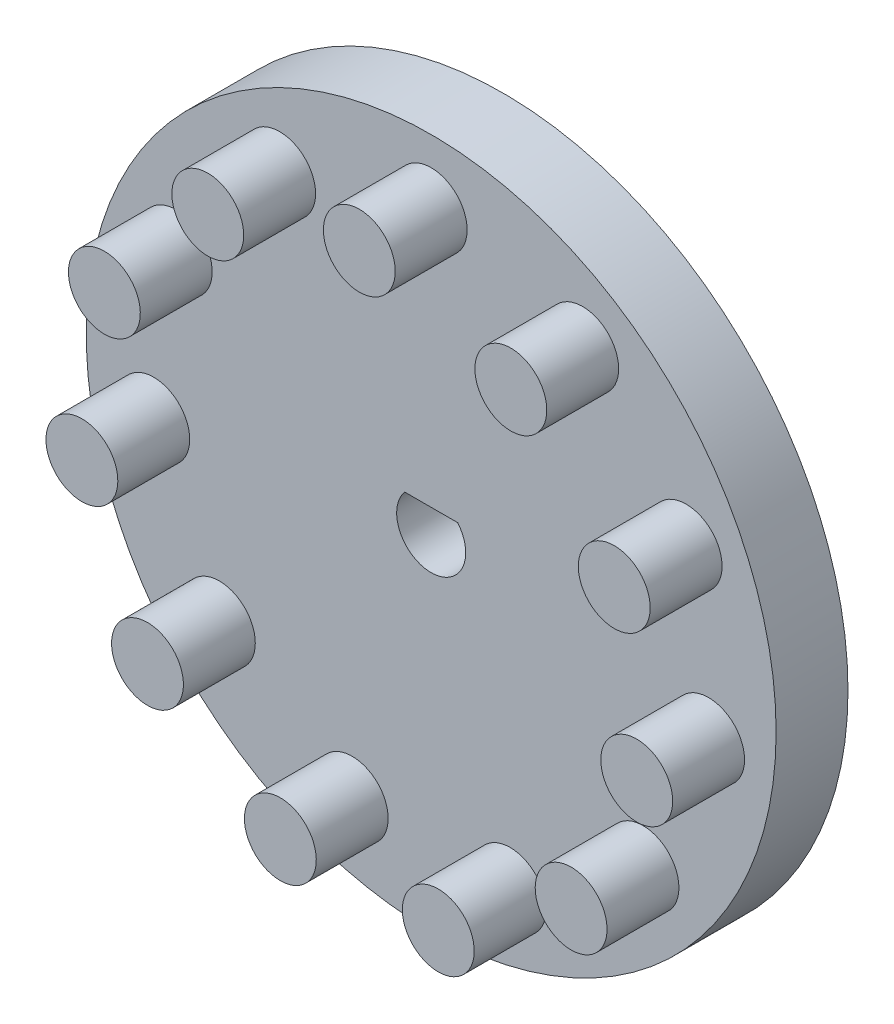
ISO-10303-21;
HEADER;
FILE_DESCRIPTION(('STEP AP214'),'2;1');
FILE_NAME('part.step','',(''),(''),'','','');
FILE_SCHEMA(('AUTOMOTIVE_DESIGN { 1 0 10303 214 1 1 1 1 }'));
ENDSEC;
DATA;
#1=APPLICATION_CONTEXT('core data for automotive mechanical design processes');
#2=APPLICATION_PROTOCOL_DEFINITION('international standard','automotive_design',2000,#1);
#3=PRODUCT_CONTEXT('',#1,'mechanical');
#4=PRODUCT('Part','Part','',(#3));
#5=PRODUCT_RELATED_PRODUCT_CATEGORY('part','',(#4));
#6=PRODUCT_DEFINITION_FORMATION('','',#4);
#7=PRODUCT_DEFINITION_CONTEXT('part definition',#1,'design');
#8=PRODUCT_DEFINITION('design','',#6,#7);
#9=PRODUCT_DEFINITION_SHAPE('','',#8);
#10=(LENGTH_UNIT() NAMED_UNIT(*) SI_UNIT(.MILLI.,.METRE.));
#11=(NAMED_UNIT(*) PLANE_ANGLE_UNIT() SI_UNIT($,.RADIAN.));
#12=(NAMED_UNIT(*) SI_UNIT($,.STERADIAN.) SOLID_ANGLE_UNIT());
#13=UNCERTAINTY_MEASURE_WITH_UNIT(LENGTH_MEASURE(1.E-05),#10,'distance_accuracy_value','');
#14=(GEOMETRIC_REPRESENTATION_CONTEXT(3) GLOBAL_UNCERTAINTY_ASSIGNED_CONTEXT((#13)) GLOBAL_UNIT_ASSIGNED_CONTEXT((#10,
#11,#12)) REPRESENTATION_CONTEXT('',''));
#15=CARTESIAN_POINT('',(0.,0.,0.));
#16=DIRECTION('',(0.,0.,1.));
#17=DIRECTION('',(1.,0.,0.));
#18=AXIS2_PLACEMENT_3D('',#15,#16,#17);
#19=CARTESIAN_POINT('',(0.,0.,3.175));
#20=DIRECTION('',(0.,0.,1.));
#21=DIRECTION('',(1.,0.,0.));
#22=AXIS2_PLACEMENT_3D('',#19,#20,#21);
#23=PLANE('',#22);
#24=CARTESIAN_POINT('',(-11.2635181824773,5.14387639849599,3.175));
#25=DIRECTION('',(0.,0.,1.));
#26=DIRECTION('',(1.,0.,0.));
#27=AXIS2_PLACEMENT_3D('',#24,#25,#26);
#28=CIRCLE('',#27,1.5875);
#29=CARTESIAN_POINT('',(-9.67601818247726,5.14387639849599,3.175));
#30=VERTEX_POINT('',#29);
#31=EDGE_CURVE('E138',#30,#30,#28,.F.);
#32=ORIENTED_EDGE('',*,*,#31,.T.);
#33=EDGE_LOOP('',(#32));
#34=FACE_BOUND('',#33,.T.);
#35=CARTESIAN_POINT('',(-9.35806910444168,-8.10881303807741,3.175));
#36=DIRECTION('',(0.,0.,1.));
#37=DIRECTION('',(1.,0.,0.));
#38=AXIS2_PLACEMENT_3D('',#35,#36,#37);
#39=CIRCLE('',#38,1.5875);
#40=CARTESIAN_POINT('',(-7.77056910444168,-8.10881303807741,3.175));
#41=VERTEX_POINT('',#40);
#42=EDGE_CURVE('E126',#41,#41,#39,.F.);
#43=ORIENTED_EDGE('',*,*,#42,.T.);
#44=EDGE_LOOP('',(#43));
#45=FACE_BOUND('',#44,.T.);
#46=CARTESIAN_POINT('',(3.48855338508892,-11.8809217457815,3.175));
#47=DIRECTION('',(0.,0.,1.));
#48=DIRECTION('',(1.,0.,0.));
#49=AXIS2_PLACEMENT_3D('',#46,#47,#48);
#50=CIRCLE('',#49,1.5875);
#51=CARTESIAN_POINT('',(5.07605338508892,-11.8809217457815,3.175));
#52=VERTEX_POINT('',#51);
#53=EDGE_CURVE('E114',#52,#52,#50,.F.);
#54=ORIENTED_EDGE('',*,*,#53,.T.);
#55=EDGE_LOOP('',(#54));
#56=FACE_BOUND('',#55,.T.);
#57=CARTESIAN_POINT('',(12.2564640040906,-1.762213484919,3.175));
#58=DIRECTION('',(0.,0.,1.));
#59=DIRECTION('',(1.,0.,0.));
#60=AXIS2_PLACEMENT_3D('',#57,#58,#59);
#61=CIRCLE('',#60,1.5875);
#62=CARTESIAN_POINT('',(13.8439640040906,-1.762213484919,3.175));
#63=VERTEX_POINT('',#62);
#64=EDGE_CURVE('E102',#63,#63,#61,.F.);
#65=ORIENTED_EDGE('',*,*,#64,.T.);
#66=EDGE_LOOP('',(#65));
#67=FACE_BOUND('',#66,.T.);
#68=CARTESIAN_POINT('',(6.69448492214395,10.4168218702821,3.175));
#69=DIRECTION('',(0.,0.,1.));
#70=DIRECTION('',(1.,0.,0.));
#71=AXIS2_PLACEMENT_3D('',#68,#69,#70);
#72=CIRCLE('',#71,1.5875);
#73=CARTESIAN_POINT('',(8.28198492214395,10.4168218702821,3.175));
#74=VERTEX_POINT('',#73);
#75=EDGE_CURVE('E90',#74,#74,#72,.F.);
#76=ORIENTED_EDGE('',*,*,#75,.T.);
#77=EDGE_LOOP('',(#76));
#78=FACE_BOUND('',#77,.T.);
#79=CARTESIAN_POINT('',(0.,12.3825,3.175));
#80=DIRECTION('',(0.,0.,1.));
#81=DIRECTION('',(1.,0.,0.));
#82=AXIS2_PLACEMENT_3D('',#79,#80,#81);
#83=CIRCLE('',#82,1.5875);
#84=CARTESIAN_POINT('',(1.5875,12.3825,3.175));
#85=VERTEX_POINT('',#84);
#86=EDGE_CURVE('E72',#85,#85,#83,.T.);
#87=ORIENTED_EDGE('',*,*,#86,.F.);
#88=EDGE_LOOP('',(#87));
#89=FACE_BOUND('',#88,.T.);
#90=CARTESIAN_POINT('',(0.,0.,3.175));
#91=DIRECTION('',(0.,0.,1.));
#92=DIRECTION('',(1.,0.,0.));
#93=AXIS2_PLACEMENT_3D('',#90,#91,#92);
#94=CIRCLE('',#93,15.24);
#95=CARTESIAN_POINT('',(15.24,0.,3.175));
#96=VERTEX_POINT('',#95);
#97=EDGE_CURVE('E83',#96,#96,#94,.T.);
#98=ORIENTED_EDGE('',*,*,#97,.T.);
#99=EDGE_LOOP('',(#98));
#100=FACE_BOUND('',#99,.T.);
#101=CARTESIAN_POINT('',(0.,0.,3.175));
#102=DIRECTION('',(0.,0.,1.));
#103=DIRECTION('',(1.,0.,0.));
#104=AXIS2_PLACEMENT_3D('',#101,#102,#103);
#105=CIRCLE('',#104,1.525);
#106=CARTESIAN_POINT('',(-1.1725,0.975124991988206,3.175));
#107=VERTEX_POINT('',#106);
#108=CARTESIAN_POINT('',(1.1725,0.975124991988206,3.175));
#109=VERTEX_POINT('',#108);
#110=EDGE_CURVE('E68',#107,#109,#105,.T.);
#111=ORIENTED_EDGE('',*,*,#110,.F.);
#112=DIRECTION('',(1.,0.,0.));
#113=VECTOR('',#112,1.);
#114=CARTESIAN_POINT('',(0.,0.975124991988206,3.175));
#115=LINE('',#114,#113);
#116=EDGE_CURVE('E53',#107,#109,#115,.T.);
#117=ORIENTED_EDGE('',*,*,#116,.T.);
#118=EDGE_LOOP('',(#111,#117));
#119=FACE_BOUND('',#118,.T.);
#120=CARTESIAN_POINT('',(11.2635181824773,5.14387639849583,3.175));
#121=DIRECTION('',(0.,0.,1.));
#122=DIRECTION('',(1.,0.,0.));
#123=AXIS2_PLACEMENT_3D('',#120,#121,#122);
#124=CIRCLE('',#123,1.5875);
#125=CARTESIAN_POINT('',(12.8510181824773,5.14387639849583,3.175));
#126=VERTEX_POINT('',#125);
#127=EDGE_CURVE('E96',#126,#126,#124,.F.);
#128=ORIENTED_EDGE('',*,*,#127,.T.);
#129=EDGE_LOOP('',(#128));
#130=FACE_BOUND('',#129,.T.);
#131=CARTESIAN_POINT('',(9.35806910444156,-8.10881303807754,3.175));
#132=DIRECTION('',(0.,0.,1.));
#133=DIRECTION('',(1.,0.,0.));
#134=AXIS2_PLACEMENT_3D('',#131,#132,#133);
#135=CIRCLE('',#134,1.5875);
#136=CARTESIAN_POINT('',(10.9455691044416,-8.10881303807754,3.175));
#137=VERTEX_POINT('',#136);
#138=EDGE_CURVE('E108',#137,#137,#135,.F.);
#139=ORIENTED_EDGE('',*,*,#138,.T.);
#140=EDGE_LOOP('',(#139));
#141=FACE_BOUND('',#140,.T.);
#142=CARTESIAN_POINT('',(-3.48855338508909,-11.8809217457815,3.175));
#143=DIRECTION('',(0.,0.,1.));
#144=DIRECTION('',(1.,0.,0.));
#145=AXIS2_PLACEMENT_3D('',#142,#143,#144);
#146=CIRCLE('',#145,1.5875);
#147=CARTESIAN_POINT('',(-1.90105338508909,-11.8809217457815,3.175));
#148=VERTEX_POINT('',#147);
#149=EDGE_CURVE('E120',#148,#148,#146,.F.);
#150=ORIENTED_EDGE('',*,*,#149,.T.);
#151=EDGE_LOOP('',(#150));
#152=FACE_BOUND('',#151,.T.);
#153=CARTESIAN_POINT('',(-12.2564640040907,-1.76221348491882,3.175));
#154=DIRECTION('',(0.,0.,1.));
#155=DIRECTION('',(1.,0.,0.));
#156=AXIS2_PLACEMENT_3D('',#153,#154,#155);
#157=CIRCLE('',#156,1.5875);
#158=CARTESIAN_POINT('',(-10.6689640040907,-1.76221348491882,3.175));
#159=VERTEX_POINT('',#158);
#160=EDGE_CURVE('E132',#159,#159,#157,.F.);
#161=ORIENTED_EDGE('',*,*,#160,.T.);
#162=EDGE_LOOP('',(#161));
#163=FACE_BOUND('',#162,.T.);
#164=CARTESIAN_POINT('',(-6.6944849221438,10.4168218702822,3.175));
#165=DIRECTION('',(0.,0.,1.));
#166=DIRECTION('',(1.,0.,0.));
#167=AXIS2_PLACEMENT_3D('',#164,#165,#166);
#168=CIRCLE('',#167,1.5875);
#169=CARTESIAN_POINT('',(-5.1069849221438,10.4168218702822,3.175));
#170=VERTEX_POINT('',#169);
#171=EDGE_CURVE('E144',#170,#170,#168,.F.);
#172=ORIENTED_EDGE('',*,*,#171,.T.);
#173=EDGE_LOOP('',(#172));
#174=FACE_BOUND('',#173,.T.);
#175=ADVANCED_FACE('F37',(#34,#45,#56,#67,#78,#89,#100,#119,#130,#141,#152,#163,#174),#23,.T.);
#176=CARTESIAN_POINT('',(0.,0.,3.175));
#177=DIRECTION('',(0.,0.,-1.));
#178=DIRECTION('',(-1.,0.,0.));
#179=AXIS2_PLACEMENT_3D('',#176,#177,#178);
#180=CYLINDRICAL_SURFACE('',#179,1.525);
#181=CARTESIAN_POINT('',(0.,0.,0.));
#182=DIRECTION('',(0.,0.,1.));
#183=DIRECTION('',(1.,0.,0.));
#184=AXIS2_PLACEMENT_3D('',#181,#182,#183);
#185=CIRCLE('',#184,1.525);
#186=CARTESIAN_POINT('',(-1.1725,0.975124991988206,0.));
#187=VERTEX_POINT('',#186);
#188=CARTESIAN_POINT('',(1.1725,0.975124991988206,0.));
#189=VERTEX_POINT('',#188);
#190=EDGE_CURVE('E67',#187,#189,#185,.T.);
#191=ORIENTED_EDGE('',*,*,#190,.F.);
#192=DIRECTION('',(0.,0.,-1.));
#193=VECTOR('',#192,1.);
#194=CARTESIAN_POINT('',(-1.1725,0.975124991988206,3.175));
#195=LINE('',#194,#193);
#196=EDGE_CURVE('E11',#107,#187,#195,.T.);
#197=ORIENTED_EDGE('',*,*,#196,.F.);
#198=ORIENTED_EDGE('',*,*,#110,.T.);
#199=DIRECTION('',(0.,0.,-1.));
#200=VECTOR('',#199,1.);
#201=CARTESIAN_POINT('',(1.1725,0.975124991988206,3.175));
#202=LINE('',#201,#200);
#203=EDGE_CURVE('E46',#109,#189,#202,.T.);
#204=ORIENTED_EDGE('',*,*,#203,.T.);
#205=EDGE_LOOP('',(#191,#197,#198,#204));
#206=FACE_BOUND('',#205,.T.);
#207=ADVANCED_FACE('F65',(#206),#180,.F.);
#208=CARTESIAN_POINT('',(0.,0.,3.175));
#209=DIRECTION('',(0.,0.,-1.));
#210=DIRECTION('',(-1.,0.,0.));
#211=AXIS2_PLACEMENT_3D('',#208,#209,#210);
#212=CYLINDRICAL_SURFACE('',#211,15.24);
#213=ORIENTED_EDGE('',*,*,#97,.F.);
#214=EDGE_LOOP('',(#213));
#215=FACE_BOUND('',#214,.T.);
#216=CARTESIAN_POINT('',(0.,0.,0.));
#217=DIRECTION('',(0.,0.,1.));
#218=DIRECTION('',(1.,0.,0.));
#219=AXIS2_PLACEMENT_3D('',#216,#217,#218);
#220=CIRCLE('',#219,15.24);
#221=CARTESIAN_POINT('',(15.24,0.,0.));
#222=VERTEX_POINT('',#221);
#223=EDGE_CURVE('E75',#222,#222,#220,.T.);
#224=ORIENTED_EDGE('',*,*,#223,.T.);
#225=EDGE_LOOP('',(#224));
#226=FACE_BOUND('',#225,.T.);
#227=ADVANCED_FACE('F39',(#215,#226),#212,.T.);
#228=CARTESIAN_POINT('',(0.,0.975124991988206,3.175));
#229=DIRECTION('',(0.,1.,0.));
#230=DIRECTION('',(0.,0.,1.));
#231=AXIS2_PLACEMENT_3D('',#228,#229,#230);
#232=PLANE('',#231);
#233=DIRECTION('',(1.,0.,0.));
#234=VECTOR('',#233,1.);
#235=CARTESIAN_POINT('',(0.,0.975124991988206,0.));
#236=LINE('',#235,#234);
#237=EDGE_CURVE('E69',#187,#189,#236,.T.);
#238=ORIENTED_EDGE('',*,*,#237,.T.);
#239=ORIENTED_EDGE('',*,*,#203,.F.);
#240=ORIENTED_EDGE('',*,*,#116,.F.);
#241=ORIENTED_EDGE('',*,*,#196,.T.);
#242=EDGE_LOOP('',(#238,#239,#240,#241));
#243=FACE_BOUND('',#242,.T.);
#244=ADVANCED_FACE('F70',(#243),#232,.F.);
#245=CARTESIAN_POINT('',(0.,0.,0.));
#246=DIRECTION('',(0.,0.,1.));
#247=DIRECTION('',(1.,0.,0.));
#248=AXIS2_PLACEMENT_3D('',#245,#246,#247);
#249=PLANE('',#248);
#250=ORIENTED_EDGE('',*,*,#223,.F.);
#251=EDGE_LOOP('',(#250));
#252=FACE_BOUND('',#251,.T.);
#253=ORIENTED_EDGE('',*,*,#190,.T.);
#254=ORIENTED_EDGE('',*,*,#237,.F.);
#255=EDGE_LOOP('',(#253,#254));
#256=FACE_BOUND('',#255,.T.);
#257=ADVANCED_FACE('F74',(#252,#256),#249,.F.);
#258=CARTESIAN_POINT('',(0.,12.3825,6.35));
#259=DIRECTION('',(0.,0.,-1.));
#260=DIRECTION('',(-1.,0.,0.));
#261=AXIS2_PLACEMENT_3D('',#258,#259,#260);
#262=CYLINDRICAL_SURFACE('',#261,1.5875);
#263=ORIENTED_EDGE('',*,*,#86,.T.);
#264=EDGE_LOOP('',(#263));
#265=FACE_BOUND('',#264,.T.);
#266=CARTESIAN_POINT('',(0.,12.3825,6.35));
#267=DIRECTION('',(0.,0.,1.));
#268=DIRECTION('',(1.,0.,0.));
#269=AXIS2_PLACEMENT_3D('',#266,#267,#268);
#270=CIRCLE('',#269,1.5875);
#271=CARTESIAN_POINT('',(1.5875,12.3825,6.35));
#272=VERTEX_POINT('',#271);
#273=EDGE_CURVE('E78',#272,#272,#270,.T.);
#274=ORIENTED_EDGE('',*,*,#273,.F.);
#275=EDGE_LOOP('',(#274));
#276=FACE_BOUND('',#275,.T.);
#277=ADVANCED_FACE('F176',(#265,#276),#262,.T.);
#278=CARTESIAN_POINT('',(0.,0.,6.35));
#279=DIRECTION('',(0.,0.,1.));
#280=DIRECTION('',(1.,0.,0.));
#281=AXIS2_PLACEMENT_3D('',#278,#279,#280);
#282=PLANE('',#281);
#283=ORIENTED_EDGE('',*,*,#273,.T.);
#284=EDGE_LOOP('',(#283));
#285=FACE_BOUND('',#284,.T.);
#286=ADVANCED_FACE('F271',(#285),#282,.T.);
#287=CARTESIAN_POINT('',(6.69448492214395,10.4168218702821,6.35));
#288=DIRECTION('',(0.,0.,-1.));
#289=DIRECTION('',(-1.,0.,0.));
#290=AXIS2_PLACEMENT_3D('',#287,#288,#289);
#291=CYLINDRICAL_SURFACE('',#290,1.5875);
#292=ORIENTED_EDGE('',*,*,#75,.F.);
#293=EDGE_LOOP('',(#292));
#294=FACE_BOUND('',#293,.T.);
#295=CARTESIAN_POINT('',(6.69448492214395,10.4168218702821,6.35));
#296=DIRECTION('',(0.,0.,1.));
#297=DIRECTION('',(0.841253532831181,-0.540640817455599,0.));
#298=AXIS2_PLACEMENT_3D('',#295,#296,#297);
#299=CIRCLE('',#298,1.5875);
#300=CARTESIAN_POINT('',(8.02997490551345,9.55855457257133,6.35));
#301=VERTEX_POINT('',#300);
#302=EDGE_CURVE('E93',#301,#301,#299,.T.);
#303=ORIENTED_EDGE('',*,*,#302,.F.);
#304=EDGE_LOOP('',(#303));
#305=FACE_BOUND('',#304,.T.);
#306=ADVANCED_FACE('F268',(#294,#305),#291,.T.);
#307=CARTESIAN_POINT('',(0.,0.,6.35));
#308=DIRECTION('',(0.,0.,1.));
#309=DIRECTION('',(0.841253532831181,-0.540640817455599,0.));
#310=AXIS2_PLACEMENT_3D('',#307,#308,#309);
#311=PLANE('',#310);
#312=ORIENTED_EDGE('',*,*,#302,.T.);
#313=EDGE_LOOP('',(#312));
#314=FACE_BOUND('',#313,.T.);
#315=ADVANCED_FACE('F264',(#314),#311,.T.);
#316=CARTESIAN_POINT('',(11.2635181824773,5.14387639849583,6.35));
#317=DIRECTION('',(0.,0.,-1.));
#318=DIRECTION('',(-1.,0.,0.));
#319=AXIS2_PLACEMENT_3D('',#316,#317,#318);
#320=CYLINDRICAL_SURFACE('',#319,1.5875);
#321=ORIENTED_EDGE('',*,*,#127,.F.);
#322=EDGE_LOOP('',(#321));
#323=FACE_BOUND('',#322,.T.);
#324=CARTESIAN_POINT('',(11.2635181824773,5.14387639849583,6.35));
#325=DIRECTION('',(0.,0.,1.));
#326=DIRECTION('',(0.415415013001884,-0.909631995354519,0.));
#327=AXIS2_PLACEMENT_3D('',#324,#325,#326);
#328=CIRCLE('',#327,1.5875);
#329=CARTESIAN_POINT('',(11.9229895156178,3.69983560587053,6.35));
#330=VERTEX_POINT('',#329);
#331=EDGE_CURVE('E99',#330,#330,#328,.T.);
#332=ORIENTED_EDGE('',*,*,#331,.F.);
#333=EDGE_LOOP('',(#332));
#334=FACE_BOUND('',#333,.T.);
#335=ADVANCED_FACE('F260',(#323,#334),#320,.T.);
#336=CARTESIAN_POINT('',(0.,0.,6.35));
#337=DIRECTION('',(0.,0.,1.));
#338=DIRECTION('',(0.415415013001884,-0.909631995354519,0.));
#339=AXIS2_PLACEMENT_3D('',#336,#337,#338);
#340=PLANE('',#339);
#341=ORIENTED_EDGE('',*,*,#331,.T.);
#342=EDGE_LOOP('',(#341));
#343=FACE_BOUND('',#342,.T.);
#344=ADVANCED_FACE('F256',(#343),#340,.T.);
#345=CARTESIAN_POINT('',(12.2564640040906,-1.762213484919,6.35));
#346=DIRECTION('',(0.,0.,-1.));
#347=DIRECTION('',(-1.,0.,0.));
#348=AXIS2_PLACEMENT_3D('',#345,#346,#347);
#349=CYLINDRICAL_SURFACE('',#348,1.5875);
#350=ORIENTED_EDGE('',*,*,#64,.F.);
#351=EDGE_LOOP('',(#350));
#352=FACE_BOUND('',#351,.T.);
#353=CARTESIAN_POINT('',(12.2564640040906,-1.762213484919,6.35));
#354=DIRECTION('',(0.,0.,1.));
#355=DIRECTION('',(-0.142314838273289,-0.989821441880932,0.));
#356=AXIS2_PLACEMENT_3D('',#353,#354,#355);
#357=CIRCLE('',#356,1.5875);
#358=CARTESIAN_POINT('',(12.0305391983318,-3.33355502390498,6.35));
#359=VERTEX_POINT('',#358);
#360=EDGE_CURVE('E105',#359,#359,#357,.T.);
#361=ORIENTED_EDGE('',*,*,#360,.F.);
#362=EDGE_LOOP('',(#361));
#363=FACE_BOUND('',#362,.T.);
#364=ADVANCED_FACE('F252',(#352,#363),#349,.T.);
#365=CARTESIAN_POINT('',(0.,0.,6.35));
#366=DIRECTION('',(0.,0.,1.));
#367=DIRECTION('',(-0.142314838273289,-0.989821441880932,0.));
#368=AXIS2_PLACEMENT_3D('',#365,#366,#367);
#369=PLANE('',#368);
#370=ORIENTED_EDGE('',*,*,#360,.T.);
#371=EDGE_LOOP('',(#370));
#372=FACE_BOUND('',#371,.T.);
#373=ADVANCED_FACE('F248',(#372),#369,.T.);
#374=CARTESIAN_POINT('',(9.35806910444156,-8.10881303807754,6.35));
#375=DIRECTION('',(0.,0.,-1.));
#376=DIRECTION('',(-1.,0.,0.));
#377=AXIS2_PLACEMENT_3D('',#374,#375,#376);
#378=CYLINDRICAL_SURFACE('',#377,1.5875);
#379=ORIENTED_EDGE('',*,*,#138,.F.);
#380=EDGE_LOOP('',(#379));
#381=FACE_BOUND('',#380,.T.);
#382=CARTESIAN_POINT('',(9.35806910444156,-8.10881303807754,6.35));
#383=DIRECTION('',(0.,0.,1.));
#384=DIRECTION('',(-0.654860733945289,-0.755749574354255,0.));
#385=AXIS2_PLACEMENT_3D('',#382,#383,#384);
#386=CIRCLE('',#385,1.5875);
#387=CARTESIAN_POINT('',(8.31847768930341,-9.30856548736492,6.35));
#388=VERTEX_POINT('',#387);
#389=EDGE_CURVE('E111',#388,#388,#386,.T.);
#390=ORIENTED_EDGE('',*,*,#389,.F.);
#391=EDGE_LOOP('',(#390));
#392=FACE_BOUND('',#391,.T.);
#393=ADVANCED_FACE('F244',(#381,#392),#378,.T.);
#394=CARTESIAN_POINT('',(0.,0.,6.35));
#395=DIRECTION('',(0.,0.,1.));
#396=DIRECTION('',(-0.654860733945289,-0.755749574354255,0.));
#397=AXIS2_PLACEMENT_3D('',#394,#395,#396);
#398=PLANE('',#397);
#399=ORIENTED_EDGE('',*,*,#389,.T.);
#400=EDGE_LOOP('',(#399));
#401=FACE_BOUND('',#400,.T.);
#402=ADVANCED_FACE('F240',(#401),#398,.T.);
#403=CARTESIAN_POINT('',(3.48855338508892,-11.8809217457815,6.35));
#404=DIRECTION('',(0.,0.,-1.));
#405=DIRECTION('',(-1.,0.,0.));
#406=AXIS2_PLACEMENT_3D('',#403,#404,#405);
#407=CYLINDRICAL_SURFACE('',#406,1.5875);
#408=ORIENTED_EDGE('',*,*,#53,.F.);
#409=EDGE_LOOP('',(#408));
#410=FACE_BOUND('',#409,.T.);
#411=CARTESIAN_POINT('',(3.48855338508892,-11.8809217457815,6.35));
#412=DIRECTION('',(0.,0.,1.));
#413=DIRECTION('',(-0.959492973614499,-0.281732556841423,0.));
#414=AXIS2_PLACEMENT_3D('',#411,#412,#413);
#415=CIRCLE('',#414,1.5875);
#416=CARTESIAN_POINT('',(1.96535828947591,-12.3281721797673,6.35));
#417=VERTEX_POINT('',#416);
#418=EDGE_CURVE('E117',#417,#417,#415,.T.);
#419=ORIENTED_EDGE('',*,*,#418,.F.);
#420=EDGE_LOOP('',(#419));
#421=FACE_BOUND('',#420,.T.);
#422=ADVANCED_FACE('F236',(#410,#421),#407,.T.);
#423=CARTESIAN_POINT('',(0.,0.,6.35));
#424=DIRECTION('',(0.,0.,1.));
#425=DIRECTION('',(-0.959492973614499,-0.281732556841423,0.));
#426=AXIS2_PLACEMENT_3D('',#423,#424,#425);
#427=PLANE('',#426);
#428=ORIENTED_EDGE('',*,*,#418,.T.);
#429=EDGE_LOOP('',(#428));
#430=FACE_BOUND('',#429,.T.);
#431=ADVANCED_FACE('F232',(#430),#427,.T.);
#432=CARTESIAN_POINT('',(-3.48855338508909,-11.8809217457815,6.35));
#433=DIRECTION('',(0.,0.,-1.));
#434=DIRECTION('',(-1.,0.,0.));
#435=AXIS2_PLACEMENT_3D('',#432,#433,#434);
#436=CYLINDRICAL_SURFACE('',#435,1.5875);
#437=ORIENTED_EDGE('',*,*,#149,.F.);
#438=EDGE_LOOP('',(#437));
#439=FACE_BOUND('',#438,.T.);
#440=CARTESIAN_POINT('',(-3.48855338508909,-11.8809217457815,6.35));
#441=DIRECTION('',(0.,0.,1.));
#442=DIRECTION('',(-0.959492973614495,0.281732556841437,0.));
#443=AXIS2_PLACEMENT_3D('',#440,#441,#442);
#444=CIRCLE('',#443,1.5875);
#445=CARTESIAN_POINT('',(-5.01174848070211,-11.4336713117957,6.35));
#446=VERTEX_POINT('',#445);
#447=EDGE_CURVE('E123',#446,#446,#444,.T.);
#448=ORIENTED_EDGE('',*,*,#447,.F.);
#449=EDGE_LOOP('',(#448));
#450=FACE_BOUND('',#449,.T.);
#451=ADVANCED_FACE('F228',(#439,#450),#436,.T.);
#452=CARTESIAN_POINT('',(0.,0.,6.35));
#453=DIRECTION('',(0.,0.,1.));
#454=DIRECTION('',(-0.959492973614495,0.281732556841437,0.));
#455=AXIS2_PLACEMENT_3D('',#452,#453,#454);
#456=PLANE('',#455);
#457=ORIENTED_EDGE('',*,*,#447,.T.);
#458=EDGE_LOOP('',(#457));
#459=FACE_BOUND('',#458,.T.);
#460=ADVANCED_FACE('F224',(#459),#456,.T.);
#461=CARTESIAN_POINT('',(-9.35806910444168,-8.10881303807741,6.35));
#462=DIRECTION('',(0.,0.,-1.));
#463=DIRECTION('',(-1.,0.,0.));
#464=AXIS2_PLACEMENT_3D('',#461,#462,#463);
#465=CYLINDRICAL_SURFACE('',#464,1.5875);
#466=ORIENTED_EDGE('',*,*,#42,.F.);
#467=EDGE_LOOP('',(#466));
#468=FACE_BOUND('',#467,.T.);
#469=CARTESIAN_POINT('',(-9.35806910444168,-8.10881303807741,6.35));
#470=DIRECTION('',(0.,0.,1.));
#471=DIRECTION('',(-0.654860733945278,0.755749574354264,0.));
#472=AXIS2_PLACEMENT_3D('',#469,#470,#471);
#473=CIRCLE('',#472,1.5875);
#474=CARTESIAN_POINT('',(-10.3976605195798,-6.90906058879001,6.35));
#475=VERTEX_POINT('',#474);
#476=EDGE_CURVE('E129',#475,#475,#473,.T.);
#477=ORIENTED_EDGE('',*,*,#476,.F.);
#478=EDGE_LOOP('',(#477));
#479=FACE_BOUND('',#478,.T.);
#480=ADVANCED_FACE('F220',(#468,#479),#465,.T.);
#481=CARTESIAN_POINT('',(0.,0.,6.35));
#482=DIRECTION('',(0.,0.,1.));
#483=DIRECTION('',(-0.654860733945278,0.755749574354264,0.));
#484=AXIS2_PLACEMENT_3D('',#481,#482,#483);
#485=PLANE('',#484);
#486=ORIENTED_EDGE('',*,*,#476,.T.);
#487=EDGE_LOOP('',(#486));
#488=FACE_BOUND('',#487,.T.);
#489=ADVANCED_FACE('F206',(#488),#485,.T.);
#490=CARTESIAN_POINT('',(-12.2564640040907,-1.76221348491882,6.35));
#491=DIRECTION('',(0.,0.,-1.));
#492=DIRECTION('',(-1.,0.,0.));
#493=AXIS2_PLACEMENT_3D('',#490,#491,#492);
#494=CYLINDRICAL_SURFACE('',#493,1.5875);
#495=ORIENTED_EDGE('',*,*,#160,.F.);
#496=EDGE_LOOP('',(#495));
#497=FACE_BOUND('',#496,.T.);
#498=CARTESIAN_POINT('',(-12.2564640040907,-1.76221348491882,6.35));
#499=DIRECTION('',(0.,0.,1.));
#500=DIRECTION('',(-0.142314838273275,0.989821441880934,0.));
#501=AXIS2_PLACEMENT_3D('',#498,#499,#500);
#502=CIRCLE('',#501,1.5875);
#503=CARTESIAN_POINT('',(-12.4823888098495,-0.19087194593284,6.35));
#504=VERTEX_POINT('',#503);
#505=EDGE_CURVE('E135',#504,#504,#502,.T.);
#506=ORIENTED_EDGE('',*,*,#505,.F.);
#507=EDGE_LOOP('',(#506));
#508=FACE_BOUND('',#507,.T.);
#509=ADVANCED_FACE('F202',(#497,#508),#494,.T.);
#510=CARTESIAN_POINT('',(0.,0.,6.35));
#511=DIRECTION('',(0.,0.,1.));
#512=DIRECTION('',(-0.142314838273275,0.989821441880934,0.));
#513=AXIS2_PLACEMENT_3D('',#510,#511,#512);
#514=PLANE('',#513);
#515=ORIENTED_EDGE('',*,*,#505,.T.);
#516=EDGE_LOOP('',(#515));
#517=FACE_BOUND('',#516,.T.);
#518=ADVANCED_FACE('F205',(#517),#514,.T.);
#519=CARTESIAN_POINT('',(-11.2635181824773,5.14387639849599,6.35));
#520=DIRECTION('',(0.,0.,-1.));
#521=DIRECTION('',(-1.,0.,0.));
#522=AXIS2_PLACEMENT_3D('',#519,#520,#521);
#523=CYLINDRICAL_SURFACE('',#522,1.5875);
#524=ORIENTED_EDGE('',*,*,#31,.F.);
#525=EDGE_LOOP('',(#524));
#526=FACE_BOUND('',#525,.T.);
#527=CARTESIAN_POINT('',(-11.2635181824773,5.14387639849599,6.35));
#528=DIRECTION('',(0.,0.,1.));
#529=DIRECTION('',(0.415415013001897,0.909631995354513,0.));
#530=AXIS2_PLACEMENT_3D('',#527,#528,#529);
#531=CIRCLE('',#530,1.5875);
#532=CARTESIAN_POINT('',(-10.6040468493367,6.58791719112128,6.35));
#533=VERTEX_POINT('',#532);
#534=EDGE_CURVE('E141',#533,#533,#531,.T.);
#535=ORIENTED_EDGE('',*,*,#534,.F.);
#536=EDGE_LOOP('',(#535));
#537=FACE_BOUND('',#536,.T.);
#538=ADVANCED_FACE('F163',(#526,#537),#523,.T.);
#539=CARTESIAN_POINT('',(0.,0.,6.35));
#540=DIRECTION('',(0.,0.,1.));
#541=DIRECTION('',(0.415415013001897,0.909631995354513,0.));
#542=AXIS2_PLACEMENT_3D('',#539,#540,#541);
#543=PLANE('',#542);
#544=ORIENTED_EDGE('',*,*,#534,.T.);
#545=EDGE_LOOP('',(#544));
#546=FACE_BOUND('',#545,.T.);
#547=ADVANCED_FACE('F155',(#546),#543,.T.);
#548=CARTESIAN_POINT('',(-6.6944849221438,10.4168218702822,6.35));
#549=DIRECTION('',(0.,0.,-1.));
#550=DIRECTION('',(-1.,0.,0.));
#551=AXIS2_PLACEMENT_3D('',#548,#549,#550);
#552=CYLINDRICAL_SURFACE('',#551,1.5875);
#553=ORIENTED_EDGE('',*,*,#171,.F.);
#554=EDGE_LOOP('',(#553));
#555=FACE_BOUND('',#554,.T.);
#556=CARTESIAN_POINT('',(-6.6944849221438,10.4168218702822,6.35));
#557=DIRECTION('',(0.,0.,1.));
#558=DIRECTION('',(0.841253532831188,0.540640817455586,0.));
#559=AXIS2_PLACEMENT_3D('',#556,#557,#558);
#560=CIRCLE('',#559,1.5875);
#561=CARTESIAN_POINT('',(-5.35899493877429,11.2750891679929,6.35));
#562=VERTEX_POINT('',#561);
#563=EDGE_CURVE('E147',#562,#562,#560,.T.);
#564=ORIENTED_EDGE('',*,*,#563,.F.);
#565=EDGE_LOOP('',(#564));
#566=FACE_BOUND('',#565,.T.);
#567=ADVANCED_FACE('F153',(#555,#566),#552,.T.);
#568=CARTESIAN_POINT('',(0.,0.,6.35));
#569=DIRECTION('',(0.,0.,1.));
#570=DIRECTION('',(0.841253532831188,0.540640817455586,0.));
#571=AXIS2_PLACEMENT_3D('',#568,#569,#570);
#572=PLANE('',#571);
#573=ORIENTED_EDGE('',*,*,#563,.T.);
#574=EDGE_LOOP('',(#573));
#575=FACE_BOUND('',#574,.T.);
#576=ADVANCED_FACE('F151',(#575),#572,.T.);
#577=CLOSED_SHELL('',(#175,#207,#227,#244,#257,#277,#286,#306,#315,#335,#344,#364,#373,#393,
#402,#422,#431,#451,#460,#480,#489,#509,#518,#538,#547,#567,#576));
#578=MANIFOLD_SOLID_BREP('B2',#577);
#579=ADVANCED_BREP_SHAPE_REPRESENTATION('',(#18,#578),#14);
#580=SHAPE_DEFINITION_REPRESENTATION(#9,#579);
ENDSEC;
END-ISO-10303-21;
